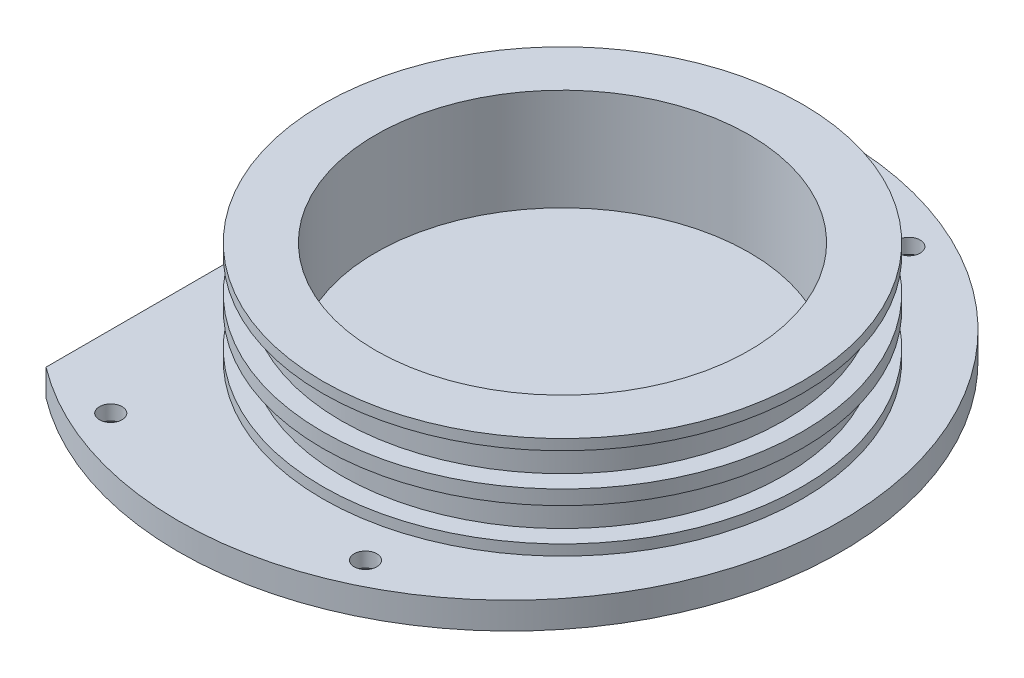
ISO-10303-21;
HEADER;
FILE_DESCRIPTION(('STEP AP214'),'2;1');
FILE_NAME('part.step','',(''),(''),'','','');
FILE_SCHEMA(('AUTOMOTIVE_DESIGN { 1 0 10303 214 1 1 1 1 }'));
ENDSEC;
DATA;
#1=APPLICATION_CONTEXT('core data for automotive mechanical design processes');
#2=APPLICATION_PROTOCOL_DEFINITION('international standard','automotive_design',2000,#1);
#3=PRODUCT_CONTEXT('',#1,'mechanical');
#4=PRODUCT('Part','Part','',(#3));
#5=PRODUCT_RELATED_PRODUCT_CATEGORY('part','',(#4));
#6=PRODUCT_DEFINITION_FORMATION('','',#4);
#7=PRODUCT_DEFINITION_CONTEXT('part definition',#1,'design');
#8=PRODUCT_DEFINITION('design','',#6,#7);
#9=PRODUCT_DEFINITION_SHAPE('','',#8);
#10=(LENGTH_UNIT() NAMED_UNIT(*) SI_UNIT(.MILLI.,.METRE.));
#11=(NAMED_UNIT(*) PLANE_ANGLE_UNIT() SI_UNIT($,.RADIAN.));
#12=(NAMED_UNIT(*) SI_UNIT($,.STERADIAN.) SOLID_ANGLE_UNIT());
#13=UNCERTAINTY_MEASURE_WITH_UNIT(LENGTH_MEASURE(1.E-05),#10,'distance_accuracy_value','');
#14=(GEOMETRIC_REPRESENTATION_CONTEXT(3) GLOBAL_UNCERTAINTY_ASSIGNED_CONTEXT((#13)) GLOBAL_UNIT_ASSIGNED_CONTEXT((#10,
#11,#12)) REPRESENTATION_CONTEXT('',''));
#15=CARTESIAN_POINT('',(0.,0.,0.));
#16=DIRECTION('',(0.,0.,1.));
#17=DIRECTION('',(1.,0.,0.));
#18=AXIS2_PLACEMENT_3D('',#15,#16,#17);
#19=CARTESIAN_POINT('',(-7.88200000000004,4.,0.));
#20=DIRECTION('',(0.,-1.,0.));
#21=DIRECTION('',(0.,0.,-1.));
#22=AXIS2_PLACEMENT_3D('',#19,#20,#21);
#23=CYLINDRICAL_SURFACE('',#22,49.53);
#24=CARTESIAN_POINT('',(-7.88200000000004,4.,0.));
#25=DIRECTION('',(0.,1.,0.));
#26=DIRECTION('',(0.,0.,1.));
#27=AXIS2_PLACEMENT_3D('',#24,#25,#26);
#28=CIRCLE('',#27,49.53);
#29=CARTESIAN_POINT('',(-37.7437767595939,4.00000000000034,39.5157587395232));
#30=VERTEX_POINT('',#29);
#31=CARTESIAN_POINT('',(-37.7437767595939,4.,-39.5157587395231));
#32=VERTEX_POINT('',#31);
#33=EDGE_CURVE('E46',#30,#32,#28,.T.);
#34=ORIENTED_EDGE('',*,*,#33,.F.);
#35=DIRECTION('',(0.,-1.,0.));
#36=VECTOR('',#35,1.);
#37=CARTESIAN_POINT('',(-37.7437767595939,19.2400000000004,39.5157587395232));
#38=LINE('',#37,#36);
#39=CARTESIAN_POINT('',(-37.7437767595939,3.88578058618805E-13,39.5157587395231));
#40=VERTEX_POINT('',#39);
#41=EDGE_CURVE('E59',#30,#40,#38,.T.);
#42=ORIENTED_EDGE('',*,*,#41,.T.);
#43=CARTESIAN_POINT('',(-7.88200000000004,0.,0.));
#44=DIRECTION('',(0.,1.,0.));
#45=DIRECTION('',(0.,0.,1.));
#46=AXIS2_PLACEMENT_3D('',#43,#44,#45);
#47=CIRCLE('',#46,49.53);
#48=CARTESIAN_POINT('',(-37.7437767595939,0.,-39.5157587395231));
#49=VERTEX_POINT('',#48);
#50=EDGE_CURVE('E73',#40,#49,#47,.T.);
#51=ORIENTED_EDGE('',*,*,#50,.T.);
#52=DIRECTION('',(0.,-1.,0.));
#53=VECTOR('',#52,1.);
#54=CARTESIAN_POINT('',(-37.7437767595939,19.24,-39.5157587395231));
#55=LINE('',#54,#53);
#56=EDGE_CURVE('E54',#32,#49,#55,.T.);
#57=ORIENTED_EDGE('',*,*,#56,.F.);
#58=EDGE_LOOP('',(#34,#42,#51,#57));
#59=FACE_BOUND('',#58,.T.);
#60=ADVANCED_FACE('F38',(#59),#23,.T.);
#61=CARTESIAN_POINT('',(0.,4.,0.));
#62=DIRECTION('',(0.,1.,0.));
#63=DIRECTION('',(0.,0.,1.));
#64=AXIS2_PLACEMENT_3D('',#61,#62,#63);
#65=PLANE('',#64);
#66=CARTESIAN_POINT('',(-26.9320000000001,4.00000000000006,40.6400000000002));
#67=DIRECTION('',(0.,1.,0.));
#68=DIRECTION('',(0.,0.,1.));
#69=AXIS2_PLACEMENT_3D('',#66,#67,#68);
#70=CIRCLE('',#69,1.7);
#71=CARTESIAN_POINT('',(-26.9320000000001,4.00000000000006,42.3400000000002));
#72=VERTEX_POINT('',#71);
#73=EDGE_CURVE('E41',#72,#72,#70,.T.);
#74=ORIENTED_EDGE('',*,*,#73,.F.);
#75=EDGE_LOOP('',(#74));
#76=FACE_BOUND('',#75,.T.);
#77=CARTESIAN_POINT('',(11.1680000000001,4.,40.6400000000002));
#78=DIRECTION('',(0.,1.,0.));
#79=DIRECTION('',(0.,0.,1.));
#80=AXIS2_PLACEMENT_3D('',#77,#78,#79);
#81=CIRCLE('',#80,1.7);
#82=CARTESIAN_POINT('',(11.1680000000001,4.,42.3400000000002));
#83=VERTEX_POINT('',#82);
#84=EDGE_CURVE('E93',#83,#83,#81,.T.);
#85=ORIENTED_EDGE('',*,*,#84,.F.);
#86=EDGE_LOOP('',(#85));
#87=FACE_BOUND('',#86,.T.);
#88=CARTESIAN_POINT('',(11.1680000000001,4.,-40.6400000000001));
#89=DIRECTION('',(0.,1.,0.));
#90=DIRECTION('',(0.,0.,1.));
#91=AXIS2_PLACEMENT_3D('',#88,#89,#90);
#92=CIRCLE('',#91,1.7);
#93=CARTESIAN_POINT('',(11.1680000000001,4.,-38.9400000000001));
#94=VERTEX_POINT('',#93);
#95=EDGE_CURVE('E89',#94,#94,#92,.T.);
#96=ORIENTED_EDGE('',*,*,#95,.F.);
#97=EDGE_LOOP('',(#96));
#98=FACE_BOUND('',#97,.T.);
#99=CARTESIAN_POINT('',(-26.9320000000001,4.,-40.6400000000001));
#100=DIRECTION('',(0.,1.,0.));
#101=DIRECTION('',(0.,0.,1.));
#102=AXIS2_PLACEMENT_3D('',#99,#100,#101);
#103=CIRCLE('',#102,1.7);
#104=CARTESIAN_POINT('',(-26.9320000000001,4.,-38.9400000000001));
#105=VERTEX_POINT('',#104);
#106=EDGE_CURVE('E69',#105,#105,#103,.T.);
#107=ORIENTED_EDGE('',*,*,#106,.F.);
#108=EDGE_LOOP('',(#107));
#109=FACE_BOUND('',#108,.T.);
#110=DIRECTION('',(0.,0.,-1.));
#111=VECTOR('',#110,1.);
#112=CARTESIAN_POINT('',(-37.7437767595939,4.,0.));
#113=LINE('',#112,#111);
#114=EDGE_CURVE('E75',#30,#32,#113,.T.);
#115=ORIENTED_EDGE('',*,*,#114,.F.);
#116=ORIENTED_EDGE('',*,*,#33,.T.);
#117=EDGE_LOOP('',(#115,#116));
#118=FACE_BOUND('',#117,.T.);
#119=CARTESIAN_POINT('',(0.,4.,0.));
#120=DIRECTION('',(0.,1.,0.));
#121=DIRECTION('',(0.,0.,1.));
#122=AXIS2_PLACEMENT_3D('',#119,#120,#121);
#123=CIRCLE('',#122,35.885499984);
#124=CARTESIAN_POINT('',(0.,4.,-35.8854999840001));
#125=VERTEX_POINT('',#124);
#126=EDGE_CURVE('E82',#125,#125,#123,.T.);
#127=ORIENTED_EDGE('',*,*,#126,.F.);
#128=EDGE_LOOP('',(#127));
#129=FACE_BOUND('',#128,.T.);
#130=ADVANCED_FACE('F149',(#76,#87,#98,#109,#118,#129),#65,.T.);
#131=CARTESIAN_POINT('',(0.,0.,0.));
#132=DIRECTION('',(0.,1.,0.));
#133=DIRECTION('',(0.,0.,1.));
#134=AXIS2_PLACEMENT_3D('',#131,#132,#133);
#135=PLANE('',#134);
#136=CARTESIAN_POINT('',(-26.9320000000001,0.,40.6400000000002));
#137=DIRECTION('',(0.,-1.,0.));
#138=DIRECTION('',(0.,0.,-1.));
#139=AXIS2_PLACEMENT_3D('',#136,#137,#138);
#140=CIRCLE('',#139,3.5);
#141=CARTESIAN_POINT('',(-26.9320000000001,0.,37.1400000000002));
#142=VERTEX_POINT('',#141);
#143=EDGE_CURVE('E373',#142,#142,#140,.T.);
#144=ORIENTED_EDGE('',*,*,#143,.F.);
#145=EDGE_LOOP('',(#144));
#146=FACE_BOUND('',#145,.T.);
#147=CARTESIAN_POINT('',(11.1680000000001,0.,40.6400000000002));
#148=DIRECTION('',(0.,-1.,0.));
#149=DIRECTION('',(0.,0.,-1.));
#150=AXIS2_PLACEMENT_3D('',#147,#148,#149);
#151=CIRCLE('',#150,3.5);
#152=CARTESIAN_POINT('',(11.1680000000001,0.,37.1400000000002));
#153=VERTEX_POINT('',#152);
#154=EDGE_CURVE('E102',#153,#153,#151,.T.);
#155=ORIENTED_EDGE('',*,*,#154,.F.);
#156=EDGE_LOOP('',(#155));
#157=FACE_BOUND('',#156,.T.);
#158=CARTESIAN_POINT('',(11.168,0.,-40.6400000000001));
#159=DIRECTION('',(0.,-1.,0.));
#160=DIRECTION('',(0.,0.,-1.));
#161=AXIS2_PLACEMENT_3D('',#158,#159,#160);
#162=CIRCLE('',#161,3.5);
#163=CARTESIAN_POINT('',(11.168,0.,-44.1400000000001));
#164=VERTEX_POINT('',#163);
#165=EDGE_CURVE('E95',#164,#164,#162,.T.);
#166=ORIENTED_EDGE('',*,*,#165,.F.);
#167=EDGE_LOOP('',(#166));
#168=FACE_BOUND('',#167,.T.);
#169=CARTESIAN_POINT('',(-26.9320000000001,0.,-40.6400000000001));
#170=DIRECTION('',(0.,-1.,0.));
#171=DIRECTION('',(0.,0.,-1.));
#172=AXIS2_PLACEMENT_3D('',#169,#170,#171);
#173=CIRCLE('',#172,3.5);
#174=CARTESIAN_POINT('',(-26.9320000000001,0.,-44.1400000000001));
#175=VERTEX_POINT('',#174);
#176=EDGE_CURVE('E91',#175,#175,#173,.T.);
#177=ORIENTED_EDGE('',*,*,#176,.F.);
#178=EDGE_LOOP('',(#177));
#179=FACE_BOUND('',#178,.T.);
#180=ORIENTED_EDGE('',*,*,#50,.F.);
#181=DIRECTION('',(0.,0.,1.));
#182=VECTOR('',#181,1.);
#183=CARTESIAN_POINT('',(-37.7437767595939,3.88578058618805E-13,39.5157587395231));
#184=LINE('',#183,#182);
#185=EDGE_CURVE('E64',#49,#40,#184,.T.);
#186=ORIENTED_EDGE('',*,*,#185,.F.);
#187=EDGE_LOOP('',(#180,#186));
#188=FACE_BOUND('',#187,.T.);
#189=ADVANCED_FACE('F77',(#146,#157,#168,#179,#188),#135,.F.);
#190=CARTESIAN_POINT('',(0.,19.24,0.));
#191=DIRECTION('',(0.,-1.,0.));
#192=DIRECTION('',(0.,0.,-1.));
#193=AXIS2_PLACEMENT_3D('',#190,#191,#192);
#194=CYLINDRICAL_SURFACE('',#193,35.885499984);
#195=CARTESIAN_POINT('',(0.,5.58750000000002,0.));
#196=DIRECTION('',(0.,1.,0.));
#197=DIRECTION('',(0.,0.,1.));
#198=AXIS2_PLACEMENT_3D('',#195,#196,#197);
#199=CIRCLE('',#198,35.885499984);
#200=CARTESIAN_POINT('',(0.,5.58750000000002,-35.8854999840001));
#201=VERTEX_POINT('',#200);
#202=EDGE_CURVE('E119',#201,#201,#199,.T.);
#203=CARTESIAN_POINT('',(0.,5.58750000000002,-35.8854999840001));
#204=CARTESIAN_POINT('',(0.,5.57096354166669,-35.8854999840001));
#205=CARTESIAN_POINT('',(0.,5.55442708333335,-35.8854999840001));
#206=CARTESIAN_POINT('',(0.,5.52135416666669,-35.8854999840001));
#207=CARTESIAN_POINT('',(0.,5.50481770833335,-35.8854999840001));
#208=CARTESIAN_POINT('',(0.,5.47174479166669,-35.8854999840001));
#209=CARTESIAN_POINT('',(0.,5.45520833333335,-35.8854999840001));
#210=CARTESIAN_POINT('',(0.,5.42213541666669,-35.8854999840001));
#211=CARTESIAN_POINT('',(0.,5.40559895833335,-35.8854999840001));
#212=CARTESIAN_POINT('',(0.,5.37252604166669,-35.8854999840001));
#213=CARTESIAN_POINT('',(0.,5.35598958333335,-35.8854999840001));
#214=CARTESIAN_POINT('',(0.,5.32291666666668,-35.8854999840001));
#215=CARTESIAN_POINT('',(0.,5.30638020833335,-35.8854999840001));
#216=CARTESIAN_POINT('',(0.,5.27330729166668,-35.8854999840001));
#217=CARTESIAN_POINT('',(0.,5.25677083333335,-35.8854999840001));
#218=CARTESIAN_POINT('',(0.,5.22369791666668,-35.8854999840001));
#219=CARTESIAN_POINT('',(0.,5.20716145833335,-35.8854999840001));
#220=CARTESIAN_POINT('',(0.,5.17408854166668,-35.8854999840001));
#221=CARTESIAN_POINT('',(0.,5.15755208333335,-35.8854999840001));
#222=CARTESIAN_POINT('',(0.,5.12447916666668,-35.8854999840001));
#223=CARTESIAN_POINT('',(0.,5.10794270833335,-35.8854999840001));
#224=CARTESIAN_POINT('',(0.,5.07486979166668,-35.8854999840001));
#225=CARTESIAN_POINT('',(0.,5.05833333333335,-35.8854999840001));
#226=CARTESIAN_POINT('',(0.,5.02526041666668,-35.8854999840001));
#227=CARTESIAN_POINT('',(0.,5.00872395833335,-35.8854999840001));
#228=CARTESIAN_POINT('',(0.,4.97565104166668,-35.8854999840001));
#229=CARTESIAN_POINT('',(0.,4.95911458333335,-35.8854999840001));
#230=CARTESIAN_POINT('',(0.,4.92604166666668,-35.8854999840001));
#231=CARTESIAN_POINT('',(0.,4.90950520833335,-35.8854999840001));
#232=CARTESIAN_POINT('',(0.,4.87643229166668,-35.8854999840001));
#233=CARTESIAN_POINT('',(0.,4.85989583333335,-35.8854999840001));
#234=CARTESIAN_POINT('',(0.,4.82682291666668,-35.8854999840001));
#235=CARTESIAN_POINT('',(0.,4.81028645833335,-35.8854999840001));
#236=CARTESIAN_POINT('',(0.,4.77721354166668,-35.8854999840001));
#237=CARTESIAN_POINT('',(0.,4.76067708333334,-35.8854999840001));
#238=CARTESIAN_POINT('',(0.,4.72760416666668,-35.8854999840001));
#239=CARTESIAN_POINT('',(0.,4.71106770833334,-35.8854999840001));
#240=CARTESIAN_POINT('',(0.,4.67799479166668,-35.8854999840001));
#241=CARTESIAN_POINT('',(0.,4.66145833333334,-35.8854999840001));
#242=CARTESIAN_POINT('',(0.,4.62838541666668,-35.8854999840001));
#243=CARTESIAN_POINT('',(0.,4.61184895833334,-35.8854999840001));
#244=CARTESIAN_POINT('',(0.,4.57877604166668,-35.8854999840001));
#245=CARTESIAN_POINT('',(0.,4.56223958333334,-35.8854999840001));
#246=CARTESIAN_POINT('',(0.,4.52916666666668,-35.8854999840001));
#247=CARTESIAN_POINT('',(0.,4.51263020833334,-35.8854999840001));
#248=CARTESIAN_POINT('',(0.,4.47955729166667,-35.8854999840001));
#249=CARTESIAN_POINT('',(0.,4.46302083333334,-35.8854999840001));
#250=CARTESIAN_POINT('',(0.,4.42994791666667,-35.8854999840001));
#251=CARTESIAN_POINT('',(0.,4.41341145833334,-35.8854999840001));
#252=CARTESIAN_POINT('',(0.,4.38033854166667,-35.8854999840001));
#253=CARTESIAN_POINT('',(0.,4.36380208333334,-35.8854999840001));
#254=CARTESIAN_POINT('',(0.,4.33072916666667,-35.8854999840001));
#255=CARTESIAN_POINT('',(0.,4.31419270833334,-35.8854999840001));
#256=CARTESIAN_POINT('',(0.,4.28111979166667,-35.8854999840001));
#257=CARTESIAN_POINT('',(0.,4.26458333333334,-35.8854999840001));
#258=CARTESIAN_POINT('',(0.,4.23151041666667,-35.8854999840001));
#259=CARTESIAN_POINT('',(0.,4.21497395833334,-35.8854999840001));
#260=CARTESIAN_POINT('',(0.,4.18190104166667,-35.8854999840001));
#261=CARTESIAN_POINT('',(0.,4.16536458333334,-35.8854999840001));
#262=CARTESIAN_POINT('',(0.,4.13229166666667,-35.8854999840001));
#263=CARTESIAN_POINT('',(0.,4.11575520833334,-35.8854999840001));
#264=CARTESIAN_POINT('',(0.,4.08268229166667,-35.8854999840001));
#265=CARTESIAN_POINT('',(0.,4.06614583333334,-35.8854999840001));
#266=CARTESIAN_POINT('',(0.,4.03307291666667,-35.8854999840001));
#267=CARTESIAN_POINT('',(0.,4.01653645833334,-35.8854999840001));
#268=CARTESIAN_POINT('',(0.,4.,-35.8854999840001));
#269=B_SPLINE_CURVE_WITH_KNOTS('',3,(#203,#204,#205,#206,#207,#208,#209,#210,#211,#212,#213,
#214,#215,#216,#217,#218,#219,#220,#221,#222,#223,#224,#225,#226,#227,#228,#229,#230,#231,#232,
#233,#234,#235,#236,#237,#238,#239,#240,#241,#242,#243,#244,#245,#246,#247,#248,#249,#250,#251,
#252,#253,#254,#255,#256,#257,#258,#259,#260,#261,#262,#263,#264,#265,#266,#267,#268),
.UNSPECIFIED.,.F.,.F.,(4,2,2,2,2,2,2,2,2,2,2,2,2,2,2,2,2,2,2,2,2,2,2,2,2,2,2,2,2,2,2,2,4),(0.,
0.0496093750000006,0.0992187500000012,0.148828125000002,0.198437500000002,0.248046875000003,
0.297656250000004,0.347265625000004,0.396875000000005,0.446484375000005,0.496093750000006,
0.545703125000007,0.595312500000007,0.644921875000008,0.694531250000008,0.744140625000009,
0.79375000000001,0.84335937500001,0.892968750000011,0.942578125000012,0.992187500000012,
1.04179687500001,1.09140625000001,1.14101562500001,1.19062500000001,1.24023437500002,
1.28984375000002,1.33945312500002,1.38906250000002,1.43867187500002,1.48828125000002,
1.53789062500002,1.58750000000002),.UNSPECIFIED.);
#270=EDGE_CURVE('BSEAM147',#201,#125,#269,.T.);
#271=ORIENTED_EDGE('',*,*,#202,.F.);
#272=ORIENTED_EDGE('',*,*,#126,.T.);
#273=ORIENTED_EDGE('',*,*,#270,.T.);
#274=ORIENTED_EDGE('',*,*,#270,.F.);
#275=EDGE_LOOP('',(#271,#273,#272,#274));
#276=FACE_BOUND('',#275,.T.);
#277=ADVANCED_FACE('F147',(#276),#194,.T.);
#278=CARTESIAN_POINT('',(0.,10.5405,35.8854999840001));
#279=DIRECTION('',(0.,1.,0.));
#280=DIRECTION('',(0.,0.,1.));
#281=AXIS2_PLACEMENT_3D('',#278,#279,#280);
#282=PLANE('',#281);
#283=CARTESIAN_POINT('',(0.,10.5405,0.));
#284=DIRECTION('',(0.,1.,0.));
#285=DIRECTION('',(0.,0.,1.));
#286=AXIS2_PLACEMENT_3D('',#283,#284,#285);
#287=CIRCLE('',#286,35.885499984);
#288=CARTESIAN_POINT('',(0.,10.5405,-35.8854999840001));
#289=VERTEX_POINT('',#288);
#290=EDGE_CURVE('E129',#289,#289,#287,.T.);
#291=ORIENTED_EDGE('',*,*,#290,.F.);
#292=EDGE_LOOP('',(#291));
#293=FACE_BOUND('',#292,.T.);
#294=CARTESIAN_POINT('',(0.,10.5405,0.));
#295=DIRECTION('',(0.,1.,0.));
#296=DIRECTION('',(0.,0.,1.));
#297=AXIS2_PLACEMENT_3D('',#294,#295,#296);
#298=CIRCLE('',#297,33.078799984);
#299=CARTESIAN_POINT('',(0.,10.5405,33.0787999840001));
#300=VERTEX_POINT('',#299);
#301=EDGE_CURVE('E126',#300,#300,#298,.T.);
#302=ORIENTED_EDGE('',*,*,#301,.T.);
#303=EDGE_LOOP('',(#302));
#304=FACE_BOUND('',#303,.T.);
#305=ADVANCED_FACE('F187',(#293,#304),#282,.F.);
#306=CARTESIAN_POINT('',(0.,19.24,0.));
#307=DIRECTION('',(0.,1.,0.));
#308=DIRECTION('',(0.,0.,1.));
#309=AXIS2_PLACEMENT_3D('',#306,#307,#308);
#310=CYLINDRICAL_SURFACE('',#309,33.078799984);
#311=ORIENTED_EDGE('',*,*,#301,.F.);
#312=EDGE_LOOP('',(#311));
#313=FACE_BOUND('',#312,.T.);
#314=CARTESIAN_POINT('',(0.,5.58750000000002,0.));
#315=DIRECTION('',(0.,1.,0.));
#316=DIRECTION('',(0.,0.,1.));
#317=AXIS2_PLACEMENT_3D('',#314,#315,#316);
#318=CIRCLE('',#317,33.078799984);
#319=CARTESIAN_POINT('',(0.,5.58750000000002,33.0787999840001));
#320=VERTEX_POINT('',#319);
#321=EDGE_CURVE('E122',#320,#320,#318,.T.);
#322=ORIENTED_EDGE('',*,*,#321,.T.);
#323=EDGE_LOOP('',(#322));
#324=FACE_BOUND('',#323,.T.);
#325=ADVANCED_FACE('F202',(#313,#324),#310,.T.);
#326=CARTESIAN_POINT('',(0.,5.58749999999997,35.8854999840001));
#327=DIRECTION('',(0.,-1.,0.));
#328=DIRECTION('',(0.,0.,-1.));
#329=AXIS2_PLACEMENT_3D('',#326,#327,#328);
#330=PLANE('',#329);
#331=ORIENTED_EDGE('',*,*,#321,.F.);
#332=EDGE_LOOP('',(#331));
#333=FACE_BOUND('',#332,.T.);
#334=ORIENTED_EDGE('',*,*,#202,.T.);
#335=EDGE_LOOP('',(#334));
#336=FACE_BOUND('',#335,.T.);
#337=ADVANCED_FACE('F206',(#333,#336),#330,.F.);
#338=CARTESIAN_POINT('',(0.,12.6995,0.));
#339=DIRECTION('',(0.,1.,0.));
#340=DIRECTION('',(0.,0.,1.));
#341=AXIS2_PLACEMENT_3D('',#338,#339,#340);
#342=CIRCLE('',#341,35.885499984);
#343=CARTESIAN_POINT('',(0.,12.6995,-35.8854999840001));
#344=VERTEX_POINT('',#343);
#345=EDGE_CURVE('E118',#344,#344,#342,.T.);
#346=CARTESIAN_POINT('',(0.,10.5405,-35.8854999840001));
#347=CARTESIAN_POINT('',(0.,10.5629895833333,-35.8854999840001));
#348=CARTESIAN_POINT('',(0.,10.5854791666667,-35.8854999840001));
#349=CARTESIAN_POINT('',(0.,10.6304583333333,-35.8854999840001));
#350=CARTESIAN_POINT('',(0.,10.6529479166667,-35.8854999840001));
#351=CARTESIAN_POINT('',(0.,10.6979270833333,-35.8854999840001));
#352=CARTESIAN_POINT('',(0.,10.7204166666667,-35.8854999840001));
#353=CARTESIAN_POINT('',(0.,10.7653958333333,-35.8854999840001));
#354=CARTESIAN_POINT('',(0.,10.7878854166667,-35.8854999840001));
#355=CARTESIAN_POINT('',(0.,10.8328645833333,-35.8854999840001));
#356=CARTESIAN_POINT('',(0.,10.8553541666667,-35.8854999840001));
#357=CARTESIAN_POINT('',(0.,10.9003333333333,-35.8854999840001));
#358=CARTESIAN_POINT('',(0.,10.9228229166667,-35.8854999840001));
#359=CARTESIAN_POINT('',(0.,10.9678020833333,-35.8854999840001));
#360=CARTESIAN_POINT('',(0.,10.9902916666667,-35.8854999840001));
#361=CARTESIAN_POINT('',(0.,11.0352708333333,-35.8854999840001));
#362=CARTESIAN_POINT('',(0.,11.0577604166667,-35.8854999840001));
#363=CARTESIAN_POINT('',(0.,11.1027395833333,-35.8854999840001));
#364=CARTESIAN_POINT('',(0.,11.1252291666667,-35.8854999840001));
#365=CARTESIAN_POINT('',(0.,11.1702083333333,-35.8854999840001));
#366=CARTESIAN_POINT('',(0.,11.1926979166667,-35.8854999840001));
#367=CARTESIAN_POINT('',(0.,11.2376770833333,-35.8854999840001));
#368=CARTESIAN_POINT('',(0.,11.2601666666667,-35.8854999840001));
#369=CARTESIAN_POINT('',(0.,11.3051458333333,-35.8854999840001));
#370=CARTESIAN_POINT('',(0.,11.3276354166667,-35.8854999840001));
#371=CARTESIAN_POINT('',(0.,11.3726145833333,-35.8854999840001));
#372=CARTESIAN_POINT('',(0.,11.3951041666667,-35.8854999840001));
#373=CARTESIAN_POINT('',(0.,11.4400833333333,-35.8854999840001));
#374=CARTESIAN_POINT('',(0.,11.4625729166667,-35.8854999840001));
#375=CARTESIAN_POINT('',(0.,11.5075520833333,-35.8854999840001));
#376=CARTESIAN_POINT('',(0.,11.5300416666667,-35.8854999840001));
#377=CARTESIAN_POINT('',(0.,11.5750208333333,-35.8854999840001));
#378=CARTESIAN_POINT('',(0.,11.5975104166667,-35.8854999840001));
#379=CARTESIAN_POINT('',(0.,11.6424895833333,-35.8854999840001));
#380=CARTESIAN_POINT('',(0.,11.6649791666667,-35.8854999840001));
#381=CARTESIAN_POINT('',(0.,11.7099583333333,-35.8854999840001));
#382=CARTESIAN_POINT('',(0.,11.7324479166667,-35.8854999840001));
#383=CARTESIAN_POINT('',(0.,11.7774270833333,-35.8854999840001));
#384=CARTESIAN_POINT('',(0.,11.7999166666667,-35.8854999840001));
#385=CARTESIAN_POINT('',(0.,11.8448958333333,-35.8854999840001));
#386=CARTESIAN_POINT('',(0.,11.8673854166667,-35.8854999840001));
#387=CARTESIAN_POINT('',(0.,11.9123645833333,-35.8854999840001));
#388=CARTESIAN_POINT('',(0.,11.9348541666667,-35.8854999840001));
#389=CARTESIAN_POINT('',(0.,11.9798333333333,-35.8854999840001));
#390=CARTESIAN_POINT('',(0.,12.0023229166667,-35.8854999840001));
#391=CARTESIAN_POINT('',(0.,12.0473020833333,-35.8854999840001));
#392=CARTESIAN_POINT('',(0.,12.0697916666667,-35.8854999840001));
#393=CARTESIAN_POINT('',(0.,12.1147708333333,-35.8854999840001));
#394=CARTESIAN_POINT('',(0.,12.1372604166666,-35.8854999840001));
#395=CARTESIAN_POINT('',(0.,12.1822395833333,-35.8854999840001));
#396=CARTESIAN_POINT('',(0.,12.2047291666666,-35.8854999840001));
#397=CARTESIAN_POINT('',(0.,12.2497083333333,-35.8854999840001));
#398=CARTESIAN_POINT('',(0.,12.2721979166666,-35.8854999840001));
#399=CARTESIAN_POINT('',(0.,12.3171770833333,-35.8854999840001));
#400=CARTESIAN_POINT('',(0.,12.3396666666666,-35.8854999840001));
#401=CARTESIAN_POINT('',(0.,12.3846458333333,-35.8854999840001));
#402=CARTESIAN_POINT('',(0.,12.4071354166666,-35.8854999840001));
#403=CARTESIAN_POINT('',(0.,12.4521145833333,-35.8854999840001));
#404=CARTESIAN_POINT('',(0.,12.4746041666666,-35.8854999840001));
#405=CARTESIAN_POINT('',(0.,12.5195833333333,-35.8854999840001));
#406=CARTESIAN_POINT('',(0.,12.5420729166666,-35.8854999840001));
#407=CARTESIAN_POINT('',(0.,12.5870520833333,-35.8854999840001));
#408=CARTESIAN_POINT('',(0.,12.6095416666666,-35.8854999840001));
#409=CARTESIAN_POINT('',(0.,12.6545208333333,-35.8854999840001));
#410=CARTESIAN_POINT('',(0.,12.6770104166666,-35.8854999840001));
#411=CARTESIAN_POINT('',(0.,12.6995,-35.8854999840001));
#412=B_SPLINE_CURVE_WITH_KNOTS('',3,(#346,#347,#348,#349,#350,#351,#352,#353,#354,#355,#356,
#357,#358,#359,#360,#361,#362,#363,#364,#365,#366,#367,#368,#369,#370,#371,#372,#373,#374,#375,
#376,#377,#378,#379,#380,#381,#382,#383,#384,#385,#386,#387,#388,#389,#390,#391,#392,#393,#394,
#395,#396,#397,#398,#399,#400,#401,#402,#403,#404,#405,#406,#407,#408,#409,#410,#411),
.UNSPECIFIED.,.F.,.F.,(4,2,2,2,2,2,2,2,2,2,2,2,2,2,2,2,2,2,2,2,2,2,2,2,2,2,2,2,2,2,2,2,4),(0.,
0.067468749999999,0.134937499999998,0.202406249999997,0.269874999999996,0.337343749999995,
0.404812499999994,0.472281249999993,0.539749999999992,0.607218749999991,0.67468749999999,
0.742156249999989,0.809624999999987,0.877093749999986,0.944562499999985,1.01203124999998,
1.07949999999998,1.14696874999998,1.21443749999998,1.28190624999998,1.34937499999998,
1.41684374999998,1.48431249999998,1.55178124999998,1.61924999999998,1.68671874999997,
1.75418749999997,1.82165624999997,1.88912499999997,1.95659374999997,2.02406249999997,
2.09153124999997,2.15899999999997),.UNSPECIFIED.);
#413=EDGE_CURVE('BSEAM191',#289,#344,#412,.T.);
#414=ORIENTED_EDGE('',*,*,#290,.T.);
#415=ORIENTED_EDGE('',*,*,#345,.F.);
#416=ORIENTED_EDGE('',*,*,#413,.T.);
#417=ORIENTED_EDGE('',*,*,#413,.F.);
#418=EDGE_LOOP('',(#414,#416,#415,#417));
#419=FACE_BOUND('',#418,.T.);
#420=ADVANCED_FACE('F191',(#419),#194,.T.);
#421=CARTESIAN_POINT('',(0.,17.6525,35.8854999840002));
#422=DIRECTION('',(0.,1.,0.));
#423=DIRECTION('',(0.,0.,1.));
#424=AXIS2_PLACEMENT_3D('',#421,#422,#423);
#425=PLANE('',#424);
#426=CARTESIAN_POINT('',(0.,17.6525,0.));
#427=DIRECTION('',(0.,1.,0.));
#428=DIRECTION('',(0.,0.,1.));
#429=AXIS2_PLACEMENT_3D('',#426,#427,#428);
#430=CIRCLE('',#429,35.885499984);
#431=CARTESIAN_POINT('',(0.,17.6525,-35.8854999840001));
#432=VERTEX_POINT('',#431);
#433=EDGE_CURVE('E123',#432,#432,#430,.T.);
#434=ORIENTED_EDGE('',*,*,#433,.F.);
#435=EDGE_LOOP('',(#434));
#436=FACE_BOUND('',#435,.T.);
#437=CARTESIAN_POINT('',(0.,17.6525,0.));
#438=DIRECTION('',(0.,1.,0.));
#439=DIRECTION('',(0.,0.,1.));
#440=AXIS2_PLACEMENT_3D('',#437,#438,#439);
#441=CIRCLE('',#440,33.078799984);
#442=CARTESIAN_POINT('',(0.,17.6525,33.0787999840001));
#443=VERTEX_POINT('',#442);
#444=EDGE_CURVE('E138',#443,#443,#441,.T.);
#445=ORIENTED_EDGE('',*,*,#444,.T.);
#446=EDGE_LOOP('',(#445));
#447=FACE_BOUND('',#446,.T.);
#448=ADVANCED_FACE('F181',(#436,#447),#425,.F.);
#449=CARTESIAN_POINT('',(0.,19.24,0.));
#450=DIRECTION('',(0.,1.,0.));
#451=DIRECTION('',(0.,0.,1.));
#452=AXIS2_PLACEMENT_3D('',#449,#450,#451);
#453=CYLINDRICAL_SURFACE('',#452,33.078799984);
#454=ORIENTED_EDGE('',*,*,#444,.F.);
#455=EDGE_LOOP('',(#454));
#456=FACE_BOUND('',#455,.T.);
#457=CARTESIAN_POINT('',(0.,12.6995,0.));
#458=DIRECTION('',(0.,1.,0.));
#459=DIRECTION('',(0.,0.,1.));
#460=AXIS2_PLACEMENT_3D('',#457,#458,#459);
#461=CIRCLE('',#460,33.078799984);
#462=CARTESIAN_POINT('',(0.,12.6995,33.0787999840001));
#463=VERTEX_POINT('',#462);
#464=EDGE_CURVE('E135',#463,#463,#461,.T.);
#465=ORIENTED_EDGE('',*,*,#464,.T.);
#466=EDGE_LOOP('',(#465));
#467=FACE_BOUND('',#466,.T.);
#468=ADVANCED_FACE('F173',(#456,#467),#453,.T.);
#469=CARTESIAN_POINT('',(0.,12.6995,35.8854999840002));
#470=DIRECTION('',(0.,-1.,0.));
#471=DIRECTION('',(0.,0.,-1.));
#472=AXIS2_PLACEMENT_3D('',#469,#470,#471);
#473=PLANE('',#472);
#474=ORIENTED_EDGE('',*,*,#464,.F.);
#475=EDGE_LOOP('',(#474));
#476=FACE_BOUND('',#475,.T.);
#477=ORIENTED_EDGE('',*,*,#345,.T.);
#478=EDGE_LOOP('',(#477));
#479=FACE_BOUND('',#478,.T.);
#480=ADVANCED_FACE('F164',(#476,#479),#473,.F.);
#481=CARTESIAN_POINT('',(0.,4.,0.));
#482=DIRECTION('',(0.,1.,0.));
#483=DIRECTION('',(0.,0.,1.));
#484=AXIS2_PLACEMENT_3D('',#481,#482,#483);
#485=CIRCLE('',#484,27.94);
#486=CARTESIAN_POINT('',(0.,4.,-27.9400000000001));
#487=VERTEX_POINT('',#486);
#488=EDGE_CURVE('E11',#487,#487,#485,.F.);
#489=ORIENTED_EDGE('',*,*,#488,.F.);
#490=EDGE_LOOP('',(#489));
#491=FACE_BOUND('',#490,.T.);
#492=ADVANCED_FACE('F153',(#491),#65,.T.);
#493=CARTESIAN_POINT('',(0.,19.24,0.));
#494=DIRECTION('',(0.,-1.,0.));
#495=DIRECTION('',(0.,0.,-1.));
#496=AXIS2_PLACEMENT_3D('',#493,#494,#495);
#497=CYLINDRICAL_SURFACE('',#496,27.94);
#498=CARTESIAN_POINT('',(0.,19.24,0.));
#499=DIRECTION('',(0.,1.,0.));
#500=DIRECTION('',(0.,0.,1.));
#501=AXIS2_PLACEMENT_3D('',#498,#499,#500);
#502=CIRCLE('',#501,27.94);
#503=CARTESIAN_POINT('',(0.,19.24,-27.9400000000001));
#504=VERTEX_POINT('',#503);
#505=EDGE_CURVE('E132',#504,#504,#502,.T.);
#506=CARTESIAN_POINT('',(0.,19.24,-27.9400000000001));
#507=CARTESIAN_POINT('',(0.,19.08125,-27.9400000000001));
#508=CARTESIAN_POINT('',(0.,18.9225,-27.9400000000001));
#509=CARTESIAN_POINT('',(0.,18.605,-27.9400000000001));
#510=CARTESIAN_POINT('',(0.,18.44625,-27.9400000000001));
#511=CARTESIAN_POINT('',(0.,18.12875,-27.9400000000001));
#512=CARTESIAN_POINT('',(0.,17.97,-27.9400000000001));
#513=CARTESIAN_POINT('',(0.,17.6525,-27.9400000000001));
#514=CARTESIAN_POINT('',(0.,17.49375,-27.9400000000001));
#515=CARTESIAN_POINT('',(0.,17.17625,-27.9400000000001));
#516=CARTESIAN_POINT('',(0.,17.0175,-27.9400000000001));
#517=CARTESIAN_POINT('',(0.,16.7,-27.9400000000001));
#518=CARTESIAN_POINT('',(0.,16.54125,-27.9400000000001));
#519=CARTESIAN_POINT('',(0.,16.22375,-27.9400000000001));
#520=CARTESIAN_POINT('',(0.,16.065,-27.9400000000001));
#521=CARTESIAN_POINT('',(0.,15.7475,-27.9400000000001));
#522=CARTESIAN_POINT('',(0.,15.58875,-27.9400000000001));
#523=CARTESIAN_POINT('',(0.,15.27125,-27.9400000000001));
#524=CARTESIAN_POINT('',(0.,15.1125,-27.9400000000001));
#525=CARTESIAN_POINT('',(0.,14.795,-27.9400000000001));
#526=CARTESIAN_POINT('',(0.,14.63625,-27.9400000000001));
#527=CARTESIAN_POINT('',(0.,14.31875,-27.9400000000001));
#528=CARTESIAN_POINT('',(0.,14.16,-27.9400000000001));
#529=CARTESIAN_POINT('',(0.,13.8425,-27.9400000000001));
#530=CARTESIAN_POINT('',(0.,13.68375,-27.9400000000001));
#531=CARTESIAN_POINT('',(0.,13.36625,-27.9400000000001));
#532=CARTESIAN_POINT('',(0.,13.2075,-27.9400000000001));
#533=CARTESIAN_POINT('',(0.,12.89,-27.9400000000001));
#534=CARTESIAN_POINT('',(0.,12.73125,-27.9400000000001));
#535=CARTESIAN_POINT('',(0.,12.41375,-27.9400000000001));
#536=CARTESIAN_POINT('',(0.,12.255,-27.9400000000001));
#537=CARTESIAN_POINT('',(0.,11.9375,-27.9400000000001));
#538=CARTESIAN_POINT('',(0.,11.77875,-27.9400000000001));
#539=CARTESIAN_POINT('',(0.,11.46125,-27.9400000000001));
#540=CARTESIAN_POINT('',(0.,11.3025,-27.9400000000001));
#541=CARTESIAN_POINT('',(0.,10.985,-27.9400000000001));
#542=CARTESIAN_POINT('',(0.,10.82625,-27.9400000000001));
#543=CARTESIAN_POINT('',(0.,10.50875,-27.9400000000001));
#544=CARTESIAN_POINT('',(0.,10.35,-27.9400000000001));
#545=CARTESIAN_POINT('',(0.,10.0325,-27.9400000000001));
#546=CARTESIAN_POINT('',(0.,9.87374999999999,-27.9400000000001));
#547=CARTESIAN_POINT('',(0.,9.55624999999999,-27.9400000000001));
#548=CARTESIAN_POINT('',(0.,9.39749999999999,-27.9400000000001));
#549=CARTESIAN_POINT('',(0.,9.07999999999999,-27.9400000000001));
#550=CARTESIAN_POINT('',(0.,8.92124999999999,-27.9400000000001));
#551=CARTESIAN_POINT('',(0.,8.60374999999999,-27.9400000000001));
#552=CARTESIAN_POINT('',(0.,8.44499999999999,-27.9400000000001));
#553=CARTESIAN_POINT('',(0.,8.1275,-27.9400000000001));
#554=CARTESIAN_POINT('',(0.,7.96874999999999,-27.9400000000001));
#555=CARTESIAN_POINT('',(0.,7.65125,-27.9400000000001));
#556=CARTESIAN_POINT('',(0.,7.4925,-27.9400000000001));
#557=CARTESIAN_POINT('',(0.,7.175,-27.9400000000001));
#558=CARTESIAN_POINT('',(0.,7.01625,-27.9400000000001));
#559=CARTESIAN_POINT('',(0.,6.69875,-27.9400000000001));
#560=CARTESIAN_POINT('',(0.,6.54,-27.9400000000001));
#561=CARTESIAN_POINT('',(0.,6.2225,-27.9400000000001));
#562=CARTESIAN_POINT('',(0.,6.06375,-27.9400000000001));
#563=CARTESIAN_POINT('',(0.,5.74625,-27.9400000000001));
#564=CARTESIAN_POINT('',(0.,5.5875,-27.9400000000001));
#565=CARTESIAN_POINT('',(0.,5.27,-27.9400000000001));
#566=CARTESIAN_POINT('',(0.,5.11125,-27.9400000000001));
#567=CARTESIAN_POINT('',(0.,4.79375,-27.9400000000001));
#568=CARTESIAN_POINT('',(0.,4.635,-27.9400000000001));
#569=CARTESIAN_POINT('',(0.,4.3175,-27.9400000000001));
#570=CARTESIAN_POINT('',(0.,4.15875,-27.9400000000001));
#571=CARTESIAN_POINT('',(0.,4.,-27.9400000000001));
#572=B_SPLINE_CURVE_WITH_KNOTS('',3,(#506,#507,#508,#509,#510,#511,#512,#513,#514,#515,#516,
#517,#518,#519,#520,#521,#522,#523,#524,#525,#526,#527,#528,#529,#530,#531,#532,#533,#534,#535,
#536,#537,#538,#539,#540,#541,#542,#543,#544,#545,#546,#547,#548,#549,#550,#551,#552,#553,#554,
#555,#556,#557,#558,#559,#560,#561,#562,#563,#564,#565,#566,#567,#568,#569,#570,#571),
.UNSPECIFIED.,.F.,.F.,(4,2,2,2,2,2,2,2,2,2,2,2,2,2,2,2,2,2,2,2,2,2,2,2,2,2,2,2,2,2,2,2,4),(0.,
0.476249999999998,0.952499999999998,1.42875,1.90499999999999,2.38124999999999,2.8575,
3.33374999999999,3.80999999999999,4.28624999999999,4.76249999999999,5.23874999999999,
5.71499999999999,6.19124999999999,6.66749999999999,7.14374999999999,7.61999999999999,
8.09624999999999,8.57249999999998,9.04874999999998,9.52499999999998,10.00125,10.4775,10.95375,
11.43,11.90625,12.3825,12.85875,13.335,13.81125,14.2875,14.76375,15.24),.UNSPECIFIED.);
#573=EDGE_CURVE('BSEAM163',#504,#487,#572,.T.);
#574=ORIENTED_EDGE('',*,*,#505,.T.);
#575=ORIENTED_EDGE('',*,*,#488,.T.);
#576=ORIENTED_EDGE('',*,*,#573,.T.);
#577=ORIENTED_EDGE('',*,*,#573,.F.);
#578=EDGE_LOOP('',(#574,#576,#575,#577));
#579=FACE_BOUND('',#578,.T.);
#580=ADVANCED_FACE('F163',(#579),#497,.F.);
#581=CARTESIAN_POINT('',(0.,19.24,0.));
#582=DIRECTION('',(0.,1.,0.));
#583=DIRECTION('',(0.,0.,1.));
#584=AXIS2_PLACEMENT_3D('',#581,#582,#583);
#585=PLANE('',#584);
#586=CARTESIAN_POINT('',(0.,19.24,0.));
#587=DIRECTION('',(0.,1.,0.));
#588=DIRECTION('',(0.,0.,1.));
#589=AXIS2_PLACEMENT_3D('',#586,#587,#588);
#590=CIRCLE('',#589,35.885499984);
#591=CARTESIAN_POINT('',(0.,19.24,-35.8854999840001));
#592=VERTEX_POINT('',#591);
#593=EDGE_CURVE('E78',#592,#592,#590,.T.);
#594=ORIENTED_EDGE('',*,*,#593,.T.);
#595=EDGE_LOOP('',(#594));
#596=FACE_BOUND('',#595,.T.);
#597=ORIENTED_EDGE('',*,*,#505,.F.);
#598=EDGE_LOOP('',(#597));
#599=FACE_BOUND('',#598,.T.);
#600=ADVANCED_FACE('F170',(#596,#599),#585,.T.);
#601=CARTESIAN_POINT('',(0.,17.6525,-35.8854999840001));
#602=CARTESIAN_POINT('',(0.,17.6690364583333,-35.8854999840001));
#603=CARTESIAN_POINT('',(0.,17.6855729166667,-35.8854999840001));
#604=CARTESIAN_POINT('',(0.,17.7186458333333,-35.8854999840001));
#605=CARTESIAN_POINT('',(0.,17.7351822916667,-35.8854999840001));
#606=CARTESIAN_POINT('',(0.,17.7682552083333,-35.8854999840001));
#607=CARTESIAN_POINT('',(0.,17.7847916666667,-35.8854999840001));
#608=CARTESIAN_POINT('',(0.,17.8178645833333,-35.8854999840001));
#609=CARTESIAN_POINT('',(0.,17.8344010416667,-35.8854999840001));
#610=CARTESIAN_POINT('',(0.,17.8674739583333,-35.8854999840001));
#611=CARTESIAN_POINT('',(0.,17.8840104166667,-35.8854999840001));
#612=CARTESIAN_POINT('',(0.,17.9170833333333,-35.8854999840001));
#613=CARTESIAN_POINT('',(0.,17.9336197916667,-35.8854999840001));
#614=CARTESIAN_POINT('',(0.,17.9666927083333,-35.8854999840001));
#615=CARTESIAN_POINT('',(0.,17.9832291666667,-35.8854999840001));
#616=CARTESIAN_POINT('',(0.,18.0163020833333,-35.8854999840001));
#617=CARTESIAN_POINT('',(0.,18.0328385416667,-35.8854999840001));
#618=CARTESIAN_POINT('',(0.,18.0659114583333,-35.8854999840001));
#619=CARTESIAN_POINT('',(0.,18.0824479166667,-35.8854999840001));
#620=CARTESIAN_POINT('',(0.,18.1155208333333,-35.8854999840001));
#621=CARTESIAN_POINT('',(0.,18.1320572916667,-35.8854999840001));
#622=CARTESIAN_POINT('',(0.,18.1651302083333,-35.8854999840001));
#623=CARTESIAN_POINT('',(0.,18.1816666666667,-35.8854999840001));
#624=CARTESIAN_POINT('',(0.,18.2147395833333,-35.8854999840001));
#625=CARTESIAN_POINT('',(0.,18.2312760416667,-35.8854999840001));
#626=CARTESIAN_POINT('',(0.,18.2643489583333,-35.8854999840001));
#627=CARTESIAN_POINT('',(0.,18.2808854166667,-35.8854999840001));
#628=CARTESIAN_POINT('',(0.,18.3139583333333,-35.8854999840001));
#629=CARTESIAN_POINT('',(0.,18.3304947916667,-35.8854999840001));
#630=CARTESIAN_POINT('',(0.,18.3635677083333,-35.8854999840001));
#631=CARTESIAN_POINT('',(0.,18.3801041666667,-35.8854999840001));
#632=CARTESIAN_POINT('',(0.,18.4131770833333,-35.8854999840001));
#633=CARTESIAN_POINT('',(0.,18.4297135416667,-35.8854999840001));
#634=CARTESIAN_POINT('',(0.,18.4627864583333,-35.8854999840001));
#635=CARTESIAN_POINT('',(0.,18.4793229166667,-35.8854999840001));
#636=CARTESIAN_POINT('',(0.,18.5123958333333,-35.8854999840001));
#637=CARTESIAN_POINT('',(0.,18.5289322916667,-35.8854999840001));
#638=CARTESIAN_POINT('',(0.,18.5620052083333,-35.8854999840001));
#639=CARTESIAN_POINT('',(0.,18.5785416666667,-35.8854999840001));
#640=CARTESIAN_POINT('',(0.,18.6116145833333,-35.8854999840001));
#641=CARTESIAN_POINT('',(0.,18.6281510416667,-35.8854999840001));
#642=CARTESIAN_POINT('',(0.,18.6612239583333,-35.8854999840001));
#643=CARTESIAN_POINT('',(0.,18.6777604166667,-35.8854999840001));
#644=CARTESIAN_POINT('',(0.,18.7108333333333,-35.8854999840001));
#645=CARTESIAN_POINT('',(0.,18.7273697916667,-35.8854999840001));
#646=CARTESIAN_POINT('',(0.,18.7604427083333,-35.8854999840001));
#647=CARTESIAN_POINT('',(0.,18.7769791666667,-35.8854999840001));
#648=CARTESIAN_POINT('',(0.,18.8100520833333,-35.8854999840001));
#649=CARTESIAN_POINT('',(0.,18.8265885416667,-35.8854999840001));
#650=CARTESIAN_POINT('',(0.,18.8596614583333,-35.8854999840001));
#651=CARTESIAN_POINT('',(0.,18.8761979166667,-35.8854999840001));
#652=CARTESIAN_POINT('',(0.,18.9092708333333,-35.8854999840001));
#653=CARTESIAN_POINT('',(0.,18.9258072916667,-35.8854999840001));
#654=CARTESIAN_POINT('',(0.,18.9588802083333,-35.8854999840001));
#655=CARTESIAN_POINT('',(0.,18.9754166666666,-35.8854999840001));
#656=CARTESIAN_POINT('',(0.,19.0084895833333,-35.8854999840001));
#657=CARTESIAN_POINT('',(0.,19.0250260416666,-35.8854999840001));
#658=CARTESIAN_POINT('',(0.,19.0580989583333,-35.8854999840001));
#659=CARTESIAN_POINT('',(0.,19.0746354166666,-35.8854999840001));
#660=CARTESIAN_POINT('',(0.,19.1077083333333,-35.8854999840001));
#661=CARTESIAN_POINT('',(0.,19.1242447916666,-35.8854999840001));
#662=CARTESIAN_POINT('',(0.,19.1573177083333,-35.8854999840001));
#663=CARTESIAN_POINT('',(0.,19.1738541666666,-35.8854999840001));
#664=CARTESIAN_POINT('',(0.,19.2069270833333,-35.8854999840001));
#665=CARTESIAN_POINT('',(0.,19.2234635416666,-35.8854999840001));
#666=CARTESIAN_POINT('',(0.,19.24,-35.8854999840001));
#667=B_SPLINE_CURVE_WITH_KNOTS('',3,(#601,#602,#603,#604,#605,#606,#607,#608,#609,#610,#611,
#612,#613,#614,#615,#616,#617,#618,#619,#620,#621,#622,#623,#624,#625,#626,#627,#628,#629,#630,
#631,#632,#633,#634,#635,#636,#637,#638,#639,#640,#641,#642,#643,#644,#645,#646,#647,#648,#649,
#650,#651,#652,#653,#654,#655,#656,#657,#658,#659,#660,#661,#662,#663,#664,#665,#666),
.UNSPECIFIED.,.F.,.F.,(4,2,2,2,2,2,2,2,2,2,2,2,2,2,2,2,2,2,2,2,2,2,2,2,2,2,2,2,2,2,2,2,4),(0.,
0.0496093749999989,0.0992187499999977,0.148828124999997,0.198437499999995,0.248046874999994,
0.297656249999993,0.347265624999992,0.396874999999991,0.44648437499999,0.496093749999989,
0.545703124999988,0.59531249999999,0.644921874999985,0.694531249999984,0.744140624999983,
0.793749999999982,0.843359374999981,0.89296874999998,0.942578124999979,0.992187499999977,
1.04179687499998,1.09140624999998,1.14101562499997,1.19062499999998,1.24023437499998,
1.28984374999997,1.33945312499997,1.38906249999997,1.43867187499997,1.48828124999997,
1.53789062499997,1.58749999999997),.UNSPECIFIED.);
#668=EDGE_CURVE('BSEAM195',#432,#592,#667,.T.);
#669=ORIENTED_EDGE('',*,*,#433,.T.);
#670=ORIENTED_EDGE('',*,*,#593,.F.);
#671=ORIENTED_EDGE('',*,*,#668,.T.);
#672=ORIENTED_EDGE('',*,*,#668,.F.);
#673=EDGE_LOOP('',(#669,#671,#670,#672));
#674=FACE_BOUND('',#673,.T.);
#675=ADVANCED_FACE('F195',(#674),#194,.T.);
#676=CARTESIAN_POINT('',(-37.7437767595939,19.2400000000004,39.5157587395232));
#677=DIRECTION('',(1.,0.,0.));
#678=DIRECTION('',(0.,0.,-1.));
#679=AXIS2_PLACEMENT_3D('',#676,#677,#678);
#680=PLANE('',#679);
#681=ORIENTED_EDGE('',*,*,#114,.T.);
#682=ORIENTED_EDGE('',*,*,#56,.T.);
#683=ORIENTED_EDGE('',*,*,#185,.T.);
#684=ORIENTED_EDGE('',*,*,#41,.F.);
#685=EDGE_LOOP('',(#681,#682,#683,#684));
#686=FACE_BOUND('',#685,.T.);
#687=ADVANCED_FACE('F65',(#686),#680,.F.);
#688=CARTESIAN_POINT('',(-26.9320000000001,0.,-40.6400000000001));
#689=DIRECTION('',(0.,-1.,0.));
#690=DIRECTION('',(0.,0.,-1.));
#691=AXIS2_PLACEMENT_3D('',#688,#689,#690);
#692=CYLINDRICAL_SURFACE('',#691,1.7);
#693=ORIENTED_EDGE('',*,*,#106,.T.);
#694=EDGE_LOOP('',(#693));
#695=FACE_BOUND('',#694,.T.);
#696=CARTESIAN_POINT('',(-26.9320000000001,1.79999999999997,-40.6400000000002));
#697=DIRECTION('',(0.,-1.,0.));
#698=DIRECTION('',(0.,0.,-1.));
#699=AXIS2_PLACEMENT_3D('',#696,#697,#698);
#700=CIRCLE('',#699,1.7);
#701=CARTESIAN_POINT('',(-26.9320000000001,1.79999999999997,-42.3400000000002));
#702=VERTEX_POINT('',#701);
#703=EDGE_CURVE('E88',#702,#702,#700,.T.);
#704=ORIENTED_EDGE('',*,*,#703,.T.);
#705=EDGE_LOOP('',(#704));
#706=FACE_BOUND('',#705,.T.);
#707=ADVANCED_FACE('F213',(#695,#706),#692,.F.);
#708=CARTESIAN_POINT('',(-26.9320000000001,0.,-40.6400000000001));
#709=DIRECTION('',(0.,-1.,0.));
#710=DIRECTION('',(0.,0.,-1.));
#711=AXIS2_PLACEMENT_3D('',#708,#709,#710);
#712=CONICAL_SURFACE('',#711,3.5,0.785398163397448);
#713=ORIENTED_EDGE('',*,*,#703,.F.);
#714=EDGE_LOOP('',(#713));
#715=FACE_BOUND('',#714,.T.);
#716=ORIENTED_EDGE('',*,*,#176,.T.);
#717=EDGE_LOOP('',(#716));
#718=FACE_BOUND('',#717,.T.);
#719=ADVANCED_FACE('F226',(#715,#718),#712,.F.);
#720=CARTESIAN_POINT('',(11.168,0.,-40.6400000000001));
#721=DIRECTION('',(0.,-1.,0.));
#722=DIRECTION('',(0.,0.,-1.));
#723=AXIS2_PLACEMENT_3D('',#720,#721,#722);
#724=CYLINDRICAL_SURFACE('',#723,1.7);
#725=ORIENTED_EDGE('',*,*,#95,.T.);
#726=EDGE_LOOP('',(#725));
#727=FACE_BOUND('',#726,.T.);
#728=CARTESIAN_POINT('',(11.168,1.80000000000002,-40.6400000000001));
#729=DIRECTION('',(0.,-1.,0.));
#730=DIRECTION('',(0.,0.,-1.));
#731=AXIS2_PLACEMENT_3D('',#728,#729,#730);
#732=CIRCLE('',#731,1.7);
#733=CARTESIAN_POINT('',(11.168,1.80000000000002,-42.3400000000001));
#734=VERTEX_POINT('',#733);
#735=EDGE_CURVE('E92',#734,#734,#732,.T.);
#736=ORIENTED_EDGE('',*,*,#735,.T.);
#737=EDGE_LOOP('',(#736));
#738=FACE_BOUND('',#737,.T.);
#739=ADVANCED_FACE('F305',(#727,#738),#724,.F.);
#740=CARTESIAN_POINT('',(11.168,0.,-40.6400000000001));
#741=DIRECTION('',(0.,-1.,0.));
#742=DIRECTION('',(0.,0.,-1.));
#743=AXIS2_PLACEMENT_3D('',#740,#741,#742);
#744=CONICAL_SURFACE('',#743,3.5,0.785398163397447);
#745=ORIENTED_EDGE('',*,*,#735,.F.);
#746=EDGE_LOOP('',(#745));
#747=FACE_BOUND('',#746,.T.);
#748=ORIENTED_EDGE('',*,*,#165,.T.);
#749=EDGE_LOOP('',(#748));
#750=FACE_BOUND('',#749,.T.);
#751=ADVANCED_FACE('F314',(#747,#750),#744,.F.);
#752=CARTESIAN_POINT('',(11.1680000000001,0.,40.6400000000002));
#753=DIRECTION('',(0.,-1.,0.));
#754=DIRECTION('',(0.,0.,-1.));
#755=AXIS2_PLACEMENT_3D('',#752,#753,#754);
#756=CYLINDRICAL_SURFACE('',#755,1.7);
#757=ORIENTED_EDGE('',*,*,#84,.T.);
#758=EDGE_LOOP('',(#757));
#759=FACE_BOUND('',#758,.T.);
#760=CARTESIAN_POINT('',(11.1680000000001,1.80000000000002,40.6400000000002));
#761=DIRECTION('',(0.,-1.,0.));
#762=DIRECTION('',(0.,0.,-1.));
#763=AXIS2_PLACEMENT_3D('',#760,#761,#762);
#764=CIRCLE('',#763,1.7);
#765=CARTESIAN_POINT('',(11.1680000000001,1.80000000000002,38.9400000000002));
#766=VERTEX_POINT('',#765);
#767=EDGE_CURVE('E96',#766,#766,#764,.T.);
#768=ORIENTED_EDGE('',*,*,#767,.T.);
#769=EDGE_LOOP('',(#768));
#770=FACE_BOUND('',#769,.T.);
#771=ADVANCED_FACE('F324',(#759,#770),#756,.F.);
#772=CARTESIAN_POINT('',(11.1680000000001,0.,40.6400000000002));
#773=DIRECTION('',(0.,-1.,0.));
#774=DIRECTION('',(0.,0.,-1.));
#775=AXIS2_PLACEMENT_3D('',#772,#773,#774);
#776=CONICAL_SURFACE('',#775,3.5,0.785398163397447);
#777=ORIENTED_EDGE('',*,*,#767,.F.);
#778=EDGE_LOOP('',(#777));
#779=FACE_BOUND('',#778,.T.);
#780=ORIENTED_EDGE('',*,*,#154,.T.);
#781=EDGE_LOOP('',(#780));
#782=FACE_BOUND('',#781,.T.);
#783=ADVANCED_FACE('F334',(#779,#782),#776,.F.);
#784=CARTESIAN_POINT('',(-26.9320000000001,0.,40.6400000000002));
#785=DIRECTION('',(0.,-1.,0.));
#786=DIRECTION('',(0.,0.,-1.));
#787=AXIS2_PLACEMENT_3D('',#784,#785,#786);
#788=CYLINDRICAL_SURFACE('',#787,1.7);
#789=ORIENTED_EDGE('',*,*,#73,.T.);
#790=EDGE_LOOP('',(#789));
#791=FACE_BOUND('',#790,.T.);
#792=CARTESIAN_POINT('',(-26.9320000000001,1.80000000000002,40.6400000000002));
#793=DIRECTION('',(0.,-1.,0.));
#794=DIRECTION('',(0.,0.,-1.));
#795=AXIS2_PLACEMENT_3D('',#792,#793,#794);
#796=CIRCLE('',#795,1.7);
#797=CARTESIAN_POINT('',(-26.9320000000001,1.80000000000002,38.9400000000002));
#798=VERTEX_POINT('',#797);
#799=EDGE_CURVE('E370',#798,#798,#796,.T.);
#800=ORIENTED_EDGE('',*,*,#799,.T.);
#801=EDGE_LOOP('',(#800));
#802=FACE_BOUND('',#801,.T.);
#803=ADVANCED_FACE('F343',(#791,#802),#788,.F.);
#804=CARTESIAN_POINT('',(-26.9320000000001,0.,40.6400000000002));
#805=DIRECTION('',(0.,-1.,0.));
#806=DIRECTION('',(0.,0.,-1.));
#807=AXIS2_PLACEMENT_3D('',#804,#805,#806);
#808=CONICAL_SURFACE('',#807,3.5,0.785398163397448);
#809=ORIENTED_EDGE('',*,*,#799,.F.);
#810=EDGE_LOOP('',(#809));
#811=FACE_BOUND('',#810,.T.);
#812=ORIENTED_EDGE('',*,*,#143,.T.);
#813=EDGE_LOOP('',(#812));
#814=FACE_BOUND('',#813,.T.);
#815=ADVANCED_FACE('F353',(#811,#814),#808,.F.);
#816=CLOSED_SHELL('',(#60,#130,#189,#277,#305,#325,#337,#420,#448,#468,#480,#492,#580,#600,#675,
#687,#707,#719,#739,#751,#771,#783,#803,#815));
#817=MANIFOLD_SOLID_BREP('B2',#816);
#818=ADVANCED_BREP_SHAPE_REPRESENTATION('',(#18,#817),#14);
#819=SHAPE_DEFINITION_REPRESENTATION(#9,#818);
ENDSEC;
END-ISO-10303-21;
